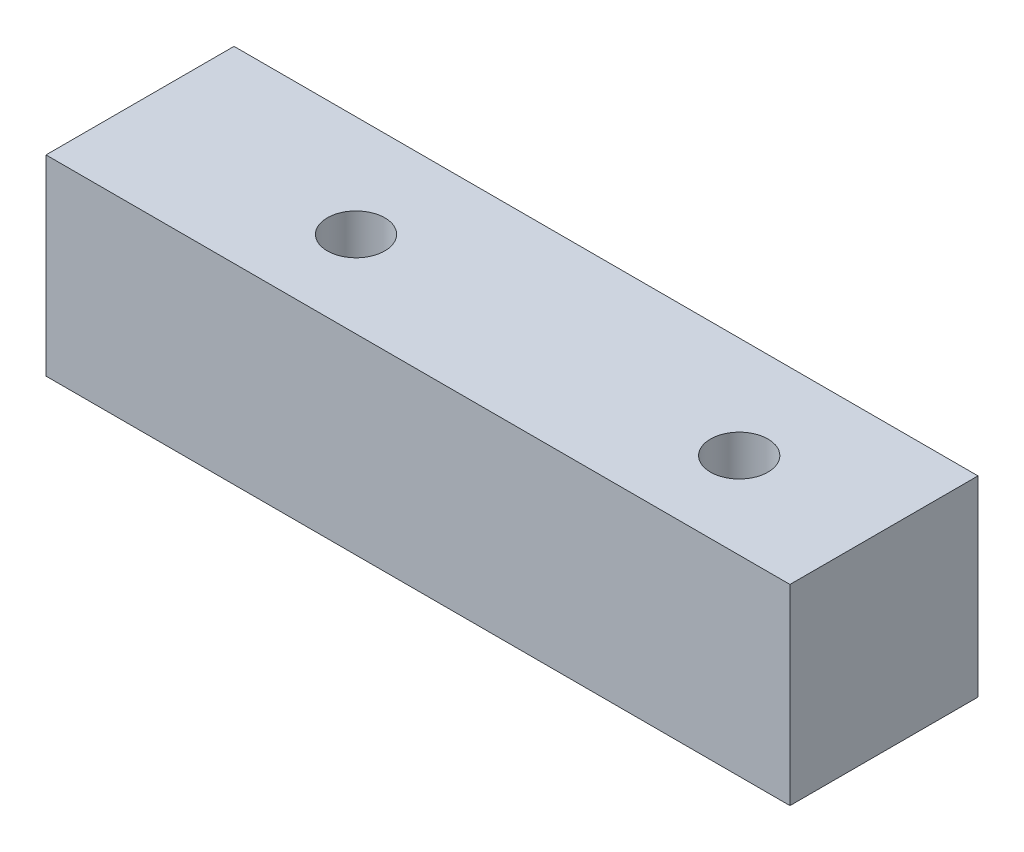
ISO-10303-21;
HEADER;
FILE_DESCRIPTION(('STEP AP214'),'2;1');
FILE_NAME('part.step','',(''),(''),'','','');
FILE_SCHEMA(('AUTOMOTIVE_DESIGN { 1 0 10303 214 1 1 1 1 }'));
ENDSEC;
DATA;
#1=APPLICATION_CONTEXT('core data for automotive mechanical design processes');
#2=APPLICATION_PROTOCOL_DEFINITION('international standard','automotive_design',2000,#1);
#3=PRODUCT_CONTEXT('',#1,'mechanical');
#4=PRODUCT('Part','Part','',(#3));
#5=PRODUCT_RELATED_PRODUCT_CATEGORY('part','',(#4));
#6=PRODUCT_DEFINITION_FORMATION('','',#4);
#7=PRODUCT_DEFINITION_CONTEXT('part definition',#1,'design');
#8=PRODUCT_DEFINITION('design','',#6,#7);
#9=PRODUCT_DEFINITION_SHAPE('','',#8);
#10=(LENGTH_UNIT() NAMED_UNIT(*) SI_UNIT(.MILLI.,.METRE.));
#11=(NAMED_UNIT(*) PLANE_ANGLE_UNIT() SI_UNIT($,.RADIAN.));
#12=(NAMED_UNIT(*) SI_UNIT($,.STERADIAN.) SOLID_ANGLE_UNIT());
#13=UNCERTAINTY_MEASURE_WITH_UNIT(LENGTH_MEASURE(1.E-05),#10,'distance_accuracy_value','');
#14=(GEOMETRIC_REPRESENTATION_CONTEXT(3) GLOBAL_UNCERTAINTY_ASSIGNED_CONTEXT((#13)) GLOBAL_UNIT_ASSIGNED_CONTEXT((#10,
#11,#12)) REPRESENTATION_CONTEXT('',''));
#15=CARTESIAN_POINT('',(0.,0.,0.));
#16=DIRECTION('',(0.,0.,1.));
#17=DIRECTION('',(1.,0.,0.));
#18=AXIS2_PLACEMENT_3D('',#15,#16,#17);
#19=CARTESIAN_POINT('',(0.,10.,0.));
#20=DIRECTION('',(0.,1.,0.));
#21=DIRECTION('',(0.,0.,1.));
#22=AXIS2_PLACEMENT_3D('',#19,#20,#21);
#23=PLANE('',#22);
#24=CARTESIAN_POINT('',(-14.9864578724946,10.,-1.75046841452216));
#25=DIRECTION('',(0.,1.,0.));
#26=DIRECTION('',(0.,0.,1.));
#27=AXIS2_PLACEMENT_3D('',#24,#25,#26);
#28=CIRCLE('',#27,1.5);
#29=CARTESIAN_POINT('',(-14.9864578724946,10.,-0.250468414522156));
#30=VERTEX_POINT('',#29);
#31=EDGE_CURVE('E118',#30,#30,#28,.T.);
#32=ORIENTED_EDGE('',*,*,#31,.F.);
#33=EDGE_LOOP('',(#32));
#34=FACE_BOUND('',#33,.T.);
#35=DIRECTION('',(0.,0.,-1.));
#36=VECTOR('',#35,1.);
#37=CARTESIAN_POINT('',(12.1621579250025,10.,-7.06500789644772));
#38=LINE('',#37,#36);
#39=CARTESIAN_POINT('',(12.1621579250025,10.,2.74953158547784));
#40=VERTEX_POINT('',#39);
#41=CARTESIAN_POINT('',(12.1621579250025,10.,-7.06500789644772));
#42=VERTEX_POINT('',#41);
#43=EDGE_CURVE('E98',#40,#42,#38,.T.);
#44=ORIENTED_EDGE('',*,*,#43,.T.);
#45=DIRECTION('',(-1.,0.,0.));
#46=VECTOR('',#45,1.);
#47=CARTESIAN_POINT('',(-26.6694492247081,10.,-7.06500789644772));
#48=LINE('',#47,#46);
#49=CARTESIAN_POINT('',(-26.6694492247081,10.,-7.06500789644772));
#50=VERTEX_POINT('',#49);
#51=EDGE_CURVE('E93',#42,#50,#48,.T.);
#52=ORIENTED_EDGE('',*,*,#51,.T.);
#53=DIRECTION('',(0.,0.,1.));
#54=VECTOR('',#53,1.);
#55=CARTESIAN_POINT('',(-26.6694492247081,10.,-7.06500789644772));
#56=LINE('',#55,#54);
#57=CARTESIAN_POINT('',(-26.6694492247081,10.,2.74953158547784));
#58=VERTEX_POINT('',#57);
#59=EDGE_CURVE('E96',#50,#58,#56,.T.);
#60=ORIENTED_EDGE('',*,*,#59,.T.);
#61=DIRECTION('',(1.,0.,0.));
#62=VECTOR('',#61,1.);
#63=CARTESIAN_POINT('',(-26.6694492247081,10.,2.74953158547784));
#64=LINE('',#63,#62);
#65=EDGE_CURVE('E63',#58,#40,#64,.T.);
#66=ORIENTED_EDGE('',*,*,#65,.T.);
#67=EDGE_LOOP('',(#44,#52,#60,#66));
#68=FACE_BOUND('',#67,.T.);
#69=CARTESIAN_POINT('',(5.01354212750539,10.,-1.75046841452216));
#70=DIRECTION('',(0.,1.,0.));
#71=DIRECTION('',(0.,0.,1.));
#72=AXIS2_PLACEMENT_3D('',#69,#70,#71);
#73=CIRCLE('',#72,1.5);
#74=CARTESIAN_POINT('',(5.01354212750539,10.,-0.250468414522156));
#75=VERTEX_POINT('',#74);
#76=EDGE_CURVE('E140',#75,#75,#73,.T.);
#77=ORIENTED_EDGE('',*,*,#76,.F.);
#78=EDGE_LOOP('',(#77));
#79=FACE_BOUND('',#78,.T.);
#80=ADVANCED_FACE('F45',(#34,#68,#79),#23,.T.);
#81=CARTESIAN_POINT('',(0.,0.,0.));
#82=DIRECTION('',(0.,1.,0.));
#83=DIRECTION('',(0.,0.,1.));
#84=AXIS2_PLACEMENT_3D('',#81,#82,#83);
#85=PLANE('',#84);
#86=DIRECTION('',(0.,0.,-1.));
#87=VECTOR('',#86,1.);
#88=CARTESIAN_POINT('',(12.1621579250025,0.,-7.06500789644772));
#89=LINE('',#88,#87);
#90=CARTESIAN_POINT('',(12.1621579250025,0.,2.74953158547784));
#91=VERTEX_POINT('',#90);
#92=CARTESIAN_POINT('',(12.1621579250025,0.,-7.06500789644772));
#93=VERTEX_POINT('',#92);
#94=EDGE_CURVE('E114',#91,#93,#89,.T.);
#95=ORIENTED_EDGE('',*,*,#94,.F.);
#96=DIRECTION('',(1.,0.,0.));
#97=VECTOR('',#96,1.);
#98=CARTESIAN_POINT('',(-26.6694492247081,0.,2.74953158547784));
#99=LINE('',#98,#97);
#100=CARTESIAN_POINT('',(-26.6694492247081,0.,2.74953158547784));
#101=VERTEX_POINT('',#100);
#102=EDGE_CURVE('E86',#101,#91,#99,.T.);
#103=ORIENTED_EDGE('',*,*,#102,.F.);
#104=DIRECTION('',(0.,0.,1.));
#105=VECTOR('',#104,1.);
#106=CARTESIAN_POINT('',(-26.6694492247081,0.,-7.06500789644772));
#107=LINE('',#106,#105);
#108=CARTESIAN_POINT('',(-26.6694492247081,0.,-7.06500789644772));
#109=VERTEX_POINT('',#108);
#110=EDGE_CURVE('E80',#109,#101,#107,.T.);
#111=ORIENTED_EDGE('',*,*,#110,.F.);
#112=DIRECTION('',(-1.,0.,0.));
#113=VECTOR('',#112,1.);
#114=CARTESIAN_POINT('',(-26.6694492247081,0.,-7.06500789644772));
#115=LINE('',#114,#113);
#116=EDGE_CURVE('E103',#93,#109,#115,.T.);
#117=ORIENTED_EDGE('',*,*,#116,.F.);
#118=EDGE_LOOP('',(#95,#103,#111,#117));
#119=FACE_BOUND('',#118,.T.);
#120=CARTESIAN_POINT('',(-14.9864578724946,0.,-1.75046841452216));
#121=DIRECTION('',(0.,1.,0.));
#122=DIRECTION('',(0.,0.,1.));
#123=AXIS2_PLACEMENT_3D('',#120,#121,#122);
#124=CIRCLE('',#123,1.5);
#125=CARTESIAN_POINT('',(-14.9864578724946,0.,-0.250468414522156));
#126=VERTEX_POINT('',#125);
#127=EDGE_CURVE('E136',#126,#126,#124,.T.);
#128=ORIENTED_EDGE('',*,*,#127,.T.);
#129=EDGE_LOOP('',(#128));
#130=FACE_BOUND('',#129,.T.);
#131=CARTESIAN_POINT('',(5.01354212750539,0.,-1.75046841452216));
#132=DIRECTION('',(0.,1.,0.));
#133=DIRECTION('',(0.,0.,1.));
#134=AXIS2_PLACEMENT_3D('',#131,#132,#133);
#135=CIRCLE('',#134,1.5);
#136=CARTESIAN_POINT('',(5.01354212750539,0.,-0.250468414522156));
#137=VERTEX_POINT('',#136);
#138=EDGE_CURVE('E144',#137,#137,#135,.T.);
#139=ORIENTED_EDGE('',*,*,#138,.T.);
#140=EDGE_LOOP('',(#139));
#141=FACE_BOUND('',#140,.T.);
#142=ADVANCED_FACE('F131',(#119,#130,#141),#85,.F.);
#143=CARTESIAN_POINT('',(12.1621579250025,10.,-7.06500789644772));
#144=DIRECTION('',(-1.,0.,0.));
#145=DIRECTION('',(0.,0.,1.));
#146=AXIS2_PLACEMENT_3D('',#143,#144,#145);
#147=PLANE('',#146);
#148=ORIENTED_EDGE('',*,*,#94,.T.);
#149=DIRECTION('',(0.,-1.,0.));
#150=VECTOR('',#149,1.);
#151=CARTESIAN_POINT('',(12.1621579250025,10.,-7.06500789644772));
#152=LINE('',#151,#150);
#153=EDGE_CURVE('E11',#42,#93,#152,.T.);
#154=ORIENTED_EDGE('',*,*,#153,.F.);
#155=ORIENTED_EDGE('',*,*,#43,.F.);
#156=DIRECTION('',(0.,-1.,0.));
#157=VECTOR('',#156,1.);
#158=CARTESIAN_POINT('',(12.1621579250025,10.,2.74953158547784));
#159=LINE('',#158,#157);
#160=EDGE_CURVE('E110',#40,#91,#159,.T.);
#161=ORIENTED_EDGE('',*,*,#160,.T.);
#162=EDGE_LOOP('',(#148,#154,#155,#161));
#163=FACE_BOUND('',#162,.T.);
#164=ADVANCED_FACE('F47',(#163),#147,.F.);
#165=CARTESIAN_POINT('',(-26.6694492247081,10.,-7.06500789644772));
#166=DIRECTION('',(0.,0.,1.));
#167=DIRECTION('',(1.,0.,0.));
#168=AXIS2_PLACEMENT_3D('',#165,#166,#167);
#169=PLANE('',#168);
#170=ORIENTED_EDGE('',*,*,#116,.T.);
#171=DIRECTION('',(0.,-1.,0.));
#172=VECTOR('',#171,1.);
#173=CARTESIAN_POINT('',(-26.6694492247081,10.,-7.06500789644772));
#174=LINE('',#173,#172);
#175=EDGE_CURVE('E55',#50,#109,#174,.T.);
#176=ORIENTED_EDGE('',*,*,#175,.F.);
#177=ORIENTED_EDGE('',*,*,#51,.F.);
#178=ORIENTED_EDGE('',*,*,#153,.T.);
#179=EDGE_LOOP('',(#170,#176,#177,#178));
#180=FACE_BOUND('',#179,.T.);
#181=ADVANCED_FACE('F102',(#180),#169,.F.);
#182=CARTESIAN_POINT('',(-26.6694492247081,10.,-7.06500789644772));
#183=DIRECTION('',(1.,0.,0.));
#184=DIRECTION('',(0.,0.,-1.));
#185=AXIS2_PLACEMENT_3D('',#182,#183,#184);
#186=PLANE('',#185);
#187=ORIENTED_EDGE('',*,*,#110,.T.);
#188=DIRECTION('',(0.,-1.,0.));
#189=VECTOR('',#188,1.);
#190=CARTESIAN_POINT('',(-26.6694492247081,10.,2.74953158547784));
#191=LINE('',#190,#189);
#192=EDGE_CURVE('E105',#58,#101,#191,.T.);
#193=ORIENTED_EDGE('',*,*,#192,.F.);
#194=ORIENTED_EDGE('',*,*,#59,.F.);
#195=ORIENTED_EDGE('',*,*,#175,.T.);
#196=EDGE_LOOP('',(#187,#193,#194,#195));
#197=FACE_BOUND('',#196,.T.);
#198=ADVANCED_FACE('F106',(#197),#186,.F.);
#199=CARTESIAN_POINT('',(-26.6694492247081,10.,2.74953158547784));
#200=DIRECTION('',(0.,0.,-1.));
#201=DIRECTION('',(-1.,0.,0.));
#202=AXIS2_PLACEMENT_3D('',#199,#200,#201);
#203=PLANE('',#202);
#204=ORIENTED_EDGE('',*,*,#102,.T.);
#205=ORIENTED_EDGE('',*,*,#160,.F.);
#206=ORIENTED_EDGE('',*,*,#65,.F.);
#207=ORIENTED_EDGE('',*,*,#192,.T.);
#208=EDGE_LOOP('',(#204,#205,#206,#207));
#209=FACE_BOUND('',#208,.T.);
#210=ADVANCED_FACE('F128',(#209),#203,.F.);
#211=CARTESIAN_POINT('',(-14.9864578724946,10.,-1.75046841452216));
#212=DIRECTION('',(0.,-1.,0.));
#213=DIRECTION('',(0.,0.,-1.));
#214=AXIS2_PLACEMENT_3D('',#211,#212,#213);
#215=CYLINDRICAL_SURFACE('',#214,1.5);
#216=ORIENTED_EDGE('',*,*,#31,.T.);
#217=EDGE_LOOP('',(#216));
#218=FACE_BOUND('',#217,.T.);
#219=ORIENTED_EDGE('',*,*,#127,.F.);
#220=EDGE_LOOP('',(#219));
#221=FACE_BOUND('',#220,.T.);
#222=ADVANCED_FACE('F163',(#218,#221),#215,.F.);
#223=CARTESIAN_POINT('',(5.01354212750539,10.,-1.75046841452216));
#224=DIRECTION('',(0.,-1.,0.));
#225=DIRECTION('',(0.,0.,-1.));
#226=AXIS2_PLACEMENT_3D('',#223,#224,#225);
#227=CYLINDRICAL_SURFACE('',#226,1.5);
#228=ORIENTED_EDGE('',*,*,#76,.T.);
#229=EDGE_LOOP('',(#228));
#230=FACE_BOUND('',#229,.T.);
#231=ORIENTED_EDGE('',*,*,#138,.F.);
#232=EDGE_LOOP('',(#231));
#233=FACE_BOUND('',#232,.T.);
#234=ADVANCED_FACE('F152',(#230,#233),#227,.F.);
#235=CLOSED_SHELL('',(#80,#142,#164,#181,#198,#210,#222,#234));
#236=MANIFOLD_SOLID_BREP('B2',#235);
#237=ADVANCED_BREP_SHAPE_REPRESENTATION('',(#18,#236),#14);
#238=SHAPE_DEFINITION_REPRESENTATION(#9,#237);
ENDSEC;
END-ISO-10303-21;
